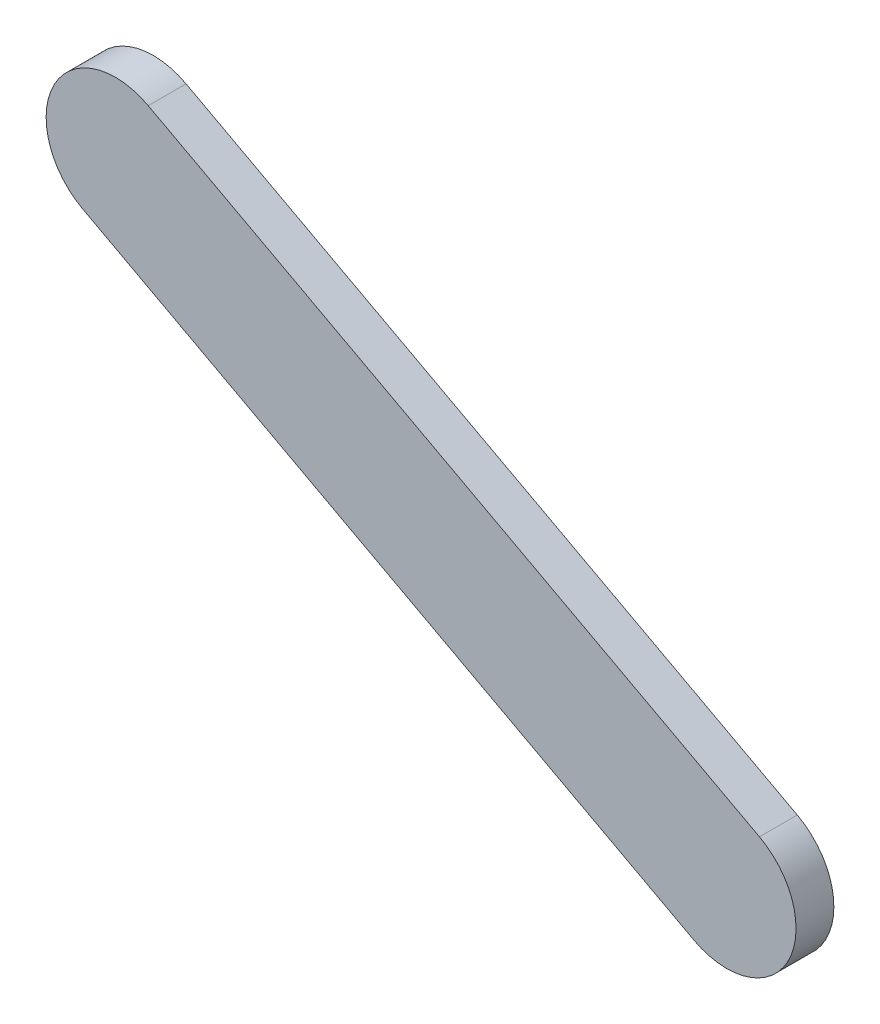
ISO-10303-21;
HEADER;
FILE_DESCRIPTION(('STEP AP214'),'2;1');
FILE_NAME('part.step','',(''),(''),'','','');
FILE_SCHEMA(('AUTOMOTIVE_DESIGN { 1 0 10303 214 1 1 1 1 }'));
ENDSEC;
DATA;
#1=APPLICATION_CONTEXT('core data for automotive mechanical design processes');
#2=APPLICATION_PROTOCOL_DEFINITION('international standard','automotive_design',2000,#1);
#3=PRODUCT_CONTEXT('',#1,'mechanical');
#4=PRODUCT('Part','Part','',(#3));
#5=PRODUCT_RELATED_PRODUCT_CATEGORY('part','',(#4));
#6=PRODUCT_DEFINITION_FORMATION('','',#4);
#7=PRODUCT_DEFINITION_CONTEXT('part definition',#1,'design');
#8=PRODUCT_DEFINITION('design','',#6,#7);
#9=PRODUCT_DEFINITION_SHAPE('','',#8);
#10=(LENGTH_UNIT() NAMED_UNIT(*) SI_UNIT(.MILLI.,.METRE.));
#11=(NAMED_UNIT(*) PLANE_ANGLE_UNIT() SI_UNIT($,.RADIAN.));
#12=(NAMED_UNIT(*) SI_UNIT($,.STERADIAN.) SOLID_ANGLE_UNIT());
#13=UNCERTAINTY_MEASURE_WITH_UNIT(LENGTH_MEASURE(1.E-05),#10,'distance_accuracy_value','');
#14=(GEOMETRIC_REPRESENTATION_CONTEXT(3) GLOBAL_UNCERTAINTY_ASSIGNED_CONTEXT((#13)) GLOBAL_UNIT_ASSIGNED_CONTEXT((#10,
#11,#12)) REPRESENTATION_CONTEXT('',''));
#15=CARTESIAN_POINT('',(0.,0.,0.));
#16=DIRECTION('',(0.,0.,1.));
#17=DIRECTION('',(1.,0.,0.));
#18=AXIS2_PLACEMENT_3D('',#15,#16,#17);
#19=CARTESIAN_POINT('',(15.0000000000001,25.9807621135331,1.5));
#20=DIRECTION('',(0.,0.,-1.));
#21=DIRECTION('',(-1.,0.,0.));
#22=AXIS2_PLACEMENT_3D('',#19,#20,#21);
#23=CYLINDRICAL_SURFACE('',#22,5.5);
#24=CARTESIAN_POINT('',(15.0000000000001,25.9807621135331,-1.5));
#25=DIRECTION('',(0.,0.,1.));
#26=DIRECTION('',(1.,0.,0.));
#27=AXIS2_PLACEMENT_3D('',#24,#25,#26);
#28=CIRCLE('',#27,5.5);
#29=CARTESIAN_POINT('',(17.5980762113534,30.8284419709494,-1.5));
#30=VERTEX_POINT('',#29);
#31=CARTESIAN_POINT('',(12.4019237886468,21.1330822561168,-1.5));
#32=VERTEX_POINT('',#31);
#33=EDGE_CURVE('E102',#30,#32,#28,.T.);
#34=ORIENTED_EDGE('',*,*,#33,.T.);
#35=DIRECTION('',(0.,0.,-1.));
#36=VECTOR('',#35,1.);
#37=CARTESIAN_POINT('',(12.4019237886468,21.1330822561168,1.5));
#38=LINE('',#37,#36);
#39=CARTESIAN_POINT('',(12.4019237886468,21.1330822561168,1.5));
#40=VERTEX_POINT('',#39);
#41=EDGE_CURVE('E11',#40,#32,#38,.T.);
#42=ORIENTED_EDGE('',*,*,#41,.F.);
#43=CARTESIAN_POINT('',(15.0000000000001,25.9807621135331,1.5));
#44=DIRECTION('',(0.,0.,1.));
#45=DIRECTION('',(1.,0.,0.));
#46=AXIS2_PLACEMENT_3D('',#43,#44,#45);
#47=CIRCLE('',#46,5.5);
#48=CARTESIAN_POINT('',(17.5980762113534,30.8284419709494,1.5));
#49=VERTEX_POINT('',#48);
#50=EDGE_CURVE('E88',#49,#40,#47,.T.);
#51=ORIENTED_EDGE('',*,*,#50,.F.);
#52=DIRECTION('',(0.,0.,-1.));
#53=VECTOR('',#52,1.);
#54=CARTESIAN_POINT('',(17.5980762113534,30.8284419709494,1.5));
#55=LINE('',#54,#53);
#56=EDGE_CURVE('E55',#49,#30,#55,.T.);
#57=ORIENTED_EDGE('',*,*,#56,.T.);
#58=EDGE_LOOP('',(#34,#42,#51,#57));
#59=FACE_BOUND('',#58,.T.);
#60=ADVANCED_FACE('F39',(#59),#23,.T.);
#61=CARTESIAN_POINT('',(12.4019237886468,21.1330822561168,1.5));
#62=DIRECTION('',(0.472377492973329,0.88139633771206,0.));
#63=DIRECTION('',(-0.881396337712061,0.472377492973329,0.));
#64=AXIS2_PLACEMENT_3D('',#61,#62,#63);
#65=PLANE('',#64);
#66=DIRECTION('',(0.88139633771206,-0.472377492973329,0.));
#67=VECTOR('',#66,1.);
#68=CARTESIAN_POINT('',(12.4019237886468,21.1330822561168,-1.5));
#69=LINE('',#68,#67);
#70=CARTESIAN_POINT('',(60.8787223628102,-4.84767985741633,-1.5));
#71=VERTEX_POINT('',#70);
#72=EDGE_CURVE('E93',#32,#71,#69,.T.);
#73=ORIENTED_EDGE('',*,*,#72,.T.);
#74=DIRECTION('',(0.,0.,-1.));
#75=VECTOR('',#74,1.);
#76=CARTESIAN_POINT('',(60.8787223628102,-4.84767985741633,1.5));
#77=LINE('',#76,#75);
#78=CARTESIAN_POINT('',(60.8787223628102,-4.84767985741633,1.5));
#79=VERTEX_POINT('',#78);
#80=EDGE_CURVE('E47',#79,#71,#77,.T.);
#81=ORIENTED_EDGE('',*,*,#80,.F.);
#82=DIRECTION('',(0.88139633771206,-0.472377492973329,0.));
#83=VECTOR('',#82,1.);
#84=CARTESIAN_POINT('',(12.4019237886468,21.1330822561168,1.5));
#85=LINE('',#84,#83);
#86=EDGE_CURVE('E81',#40,#79,#85,.T.);
#87=ORIENTED_EDGE('',*,*,#86,.F.);
#88=ORIENTED_EDGE('',*,*,#41,.T.);
#89=EDGE_LOOP('',(#73,#81,#87,#88));
#90=FACE_BOUND('',#89,.T.);
#91=ADVANCED_FACE('F92',(#90),#65,.F.);
#92=CARTESIAN_POINT('',(63.4767985741635,0.,1.5));
#93=DIRECTION('',(0.,0.,-1.));
#94=DIRECTION('',(-1.,0.,0.));
#95=AXIS2_PLACEMENT_3D('',#92,#93,#94);
#96=CYLINDRICAL_SURFACE('',#95,5.49999999999999);
#97=CARTESIAN_POINT('',(63.4767985741635,0.,-1.5));
#98=DIRECTION('',(0.,0.,1.));
#99=DIRECTION('',(1.,0.,0.));
#100=AXIS2_PLACEMENT_3D('',#97,#98,#99);
#101=CIRCLE('',#100,5.49999999999999);
#102=CARTESIAN_POINT('',(66.0748747855168,4.84767985741633,-1.5));
#103=VERTEX_POINT('',#102);
#104=EDGE_CURVE('E105',#71,#103,#101,.T.);
#105=ORIENTED_EDGE('',*,*,#104,.T.);
#106=DIRECTION('',(0.,0.,-1.));
#107=VECTOR('',#106,1.);
#108=CARTESIAN_POINT('',(66.0748747855168,4.84767985741633,1.5));
#109=LINE('',#108,#107);
#110=CARTESIAN_POINT('',(66.0748747855168,4.84767985741633,1.5));
#111=VERTEX_POINT('',#110);
#112=EDGE_CURVE('E70',#111,#103,#109,.T.);
#113=ORIENTED_EDGE('',*,*,#112,.F.);
#114=CARTESIAN_POINT('',(63.4767985741635,0.,1.5));
#115=DIRECTION('',(0.,0.,1.));
#116=DIRECTION('',(1.,0.,0.));
#117=AXIS2_PLACEMENT_3D('',#114,#115,#116);
#118=CIRCLE('',#117,5.49999999999999);
#119=EDGE_CURVE('E87',#79,#111,#118,.T.);
#120=ORIENTED_EDGE('',*,*,#119,.F.);
#121=ORIENTED_EDGE('',*,*,#80,.T.);
#122=EDGE_LOOP('',(#105,#113,#120,#121));
#123=FACE_BOUND('',#122,.T.);
#124=ADVANCED_FACE('F96',(#123),#96,.T.);
#125=CARTESIAN_POINT('',(17.5980762113534,30.8284419709494,1.5));
#126=DIRECTION('',(0.472377492973329,0.88139633771206,0.));
#127=DIRECTION('',(-0.881396337712061,0.472377492973329,0.));
#128=AXIS2_PLACEMENT_3D('',#125,#126,#127);
#129=PLANE('',#128);
#130=DIRECTION('',(0.88139633771206,-0.472377492973329,0.));
#131=VECTOR('',#130,1.);
#132=CARTESIAN_POINT('',(17.5980762113534,30.8284419709494,-1.5));
#133=LINE('',#132,#131);
#134=EDGE_CURVE('E107',#30,#103,#133,.T.);
#135=ORIENTED_EDGE('',*,*,#134,.F.);
#136=ORIENTED_EDGE('',*,*,#56,.F.);
#137=DIRECTION('',(0.88139633771206,-0.472377492973329,0.));
#138=VECTOR('',#137,1.);
#139=CARTESIAN_POINT('',(17.5980762113534,30.8284419709494,1.5));
#140=LINE('',#139,#138);
#141=EDGE_CURVE('E97',#49,#111,#140,.T.);
#142=ORIENTED_EDGE('',*,*,#141,.T.);
#143=ORIENTED_EDGE('',*,*,#112,.T.);
#144=EDGE_LOOP('',(#135,#136,#142,#143));
#145=FACE_BOUND('',#144,.T.);
#146=ADVANCED_FACE('F113',(#145),#129,.T.);
#147=CARTESIAN_POINT('',(15.0000000000001,25.9807621135331,1.5));
#148=DIRECTION('',(0.,0.,1.));
#149=DIRECTION('',(1.,0.,0.));
#150=AXIS2_PLACEMENT_3D('',#147,#148,#149);
#151=PLANE('',#150);
#152=ORIENTED_EDGE('',*,*,#50,.T.);
#153=ORIENTED_EDGE('',*,*,#86,.T.);
#154=ORIENTED_EDGE('',*,*,#119,.T.);
#155=ORIENTED_EDGE('',*,*,#141,.F.);
#156=EDGE_LOOP('',(#152,#153,#154,#155));
#157=FACE_BOUND('',#156,.T.);
#158=ADVANCED_FACE('F84',(#157),#151,.T.);
#159=CARTESIAN_POINT('',(15.0000000000001,25.9807621135331,-1.5));
#160=DIRECTION('',(0.,0.,1.));
#161=DIRECTION('',(1.,0.,0.));
#162=AXIS2_PLACEMENT_3D('',#159,#160,#161);
#163=PLANE('',#162);
#164=ORIENTED_EDGE('',*,*,#33,.F.);
#165=ORIENTED_EDGE('',*,*,#134,.T.);
#166=ORIENTED_EDGE('',*,*,#104,.F.);
#167=ORIENTED_EDGE('',*,*,#72,.F.);
#168=EDGE_LOOP('',(#164,#165,#166,#167));
#169=FACE_BOUND('',#168,.T.);
#170=ADVANCED_FACE('F112',(#169),#163,.F.);
#171=CLOSED_SHELL('',(#60,#91,#124,#146,#158,#170));
#172=MANIFOLD_SOLID_BREP('B2',#171);
#173=ADVANCED_BREP_SHAPE_REPRESENTATION('',(#18,#172),#14);
#174=SHAPE_DEFINITION_REPRESENTATION(#9,#173);
ENDSEC;
END-ISO-10303-21;
